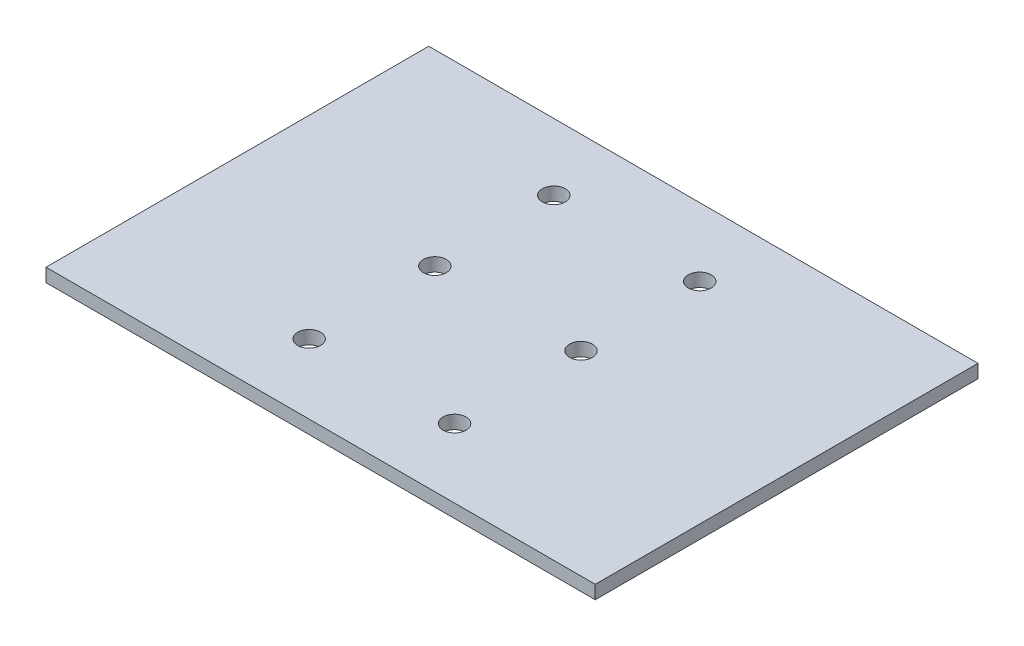
ISO-10303-21;
HEADER;
FILE_DESCRIPTION(('STEP AP214'),'2;1');
FILE_NAME('part.step','',(''),(''),'','','');
FILE_SCHEMA(('AUTOMOTIVE_DESIGN { 1 0 10303 214 1 1 1 1 }'));
ENDSEC;
DATA;
#1=APPLICATION_CONTEXT('core data for automotive mechanical design processes');
#2=APPLICATION_PROTOCOL_DEFINITION('international standard','automotive_design',2000,#1);
#3=PRODUCT_CONTEXT('',#1,'mechanical');
#4=PRODUCT('Part','Part','',(#3));
#5=PRODUCT_RELATED_PRODUCT_CATEGORY('part','',(#4));
#6=PRODUCT_DEFINITION_FORMATION('','',#4);
#7=PRODUCT_DEFINITION_CONTEXT('part definition',#1,'design');
#8=PRODUCT_DEFINITION('design','',#6,#7);
#9=PRODUCT_DEFINITION_SHAPE('','',#8);
#10=(LENGTH_UNIT() NAMED_UNIT(*) SI_UNIT(.MILLI.,.METRE.));
#11=(NAMED_UNIT(*) PLANE_ANGLE_UNIT() SI_UNIT($,.RADIAN.));
#12=(NAMED_UNIT(*) SI_UNIT($,.STERADIAN.) SOLID_ANGLE_UNIT());
#13=UNCERTAINTY_MEASURE_WITH_UNIT(LENGTH_MEASURE(1.E-05),#10,'distance_accuracy_value','');
#14=(GEOMETRIC_REPRESENTATION_CONTEXT(3) GLOBAL_UNCERTAINTY_ASSIGNED_CONTEXT((#13)) GLOBAL_UNIT_ASSIGNED_CONTEXT((#10,
#11,#12)) REPRESENTATION_CONTEXT('',''));
#15=CARTESIAN_POINT('',(0.,0.,0.));
#16=DIRECTION('',(0.,0.,1.));
#17=DIRECTION('',(1.,0.,0.));
#18=AXIS2_PLACEMENT_3D('',#15,#16,#17);
#19=CARTESIAN_POINT('',(0.,0.,0.));
#20=DIRECTION('',(0.,-1.,0.));
#21=DIRECTION('',(0.,0.,-1.));
#22=AXIS2_PLACEMENT_3D('',#19,#20,#21);
#23=PLANE('',#22);
#24=CARTESIAN_POINT('',(23.2212951849101,0.,-10.5729993652602));
#25=DIRECTION('',(0.,1.,0.));
#26=DIRECTION('',(0.,0.,1.));
#27=AXIS2_PLACEMENT_3D('',#24,#25,#26);
#28=CIRCLE('',#27,2.99999999999996);
#29=CARTESIAN_POINT('',(23.2212951849101,0.,-7.57299936526024));
#30=VERTEX_POINT('',#29);
#31=EDGE_CURVE('E142',#30,#30,#28,.T.);
#32=ORIENTED_EDGE('',*,*,#31,.T.);
#33=EDGE_LOOP('',(#32));
#34=FACE_BOUND('',#33,.T.);
#35=CARTESIAN_POINT('',(23.7222637231719,0.,53.8593610896501));
#36=DIRECTION('',(0.,1.,0.));
#37=DIRECTION('',(0.,0.,1.));
#38=AXIS2_PLACEMENT_3D('',#35,#36,#37);
#39=CIRCLE('',#38,2.99999999999996);
#40=CARTESIAN_POINT('',(23.7222637231719,0.,56.8593610896501));
#41=VERTEX_POINT('',#40);
#42=EDGE_CURVE('E136',#41,#41,#39,.T.);
#43=ORIENTED_EDGE('',*,*,#42,.T.);
#44=EDGE_LOOP('',(#43));
#45=FACE_BOUND('',#44,.T.);
#46=CARTESIAN_POINT('',(23.6824415477906,0.,20.9740262170182));
#47=DIRECTION('',(0.,1.,0.));
#48=DIRECTION('',(0.,0.,1.));
#49=AXIS2_PLACEMENT_3D('',#46,#47,#48);
#50=CIRCLE('',#49,2.99999999999996);
#51=CARTESIAN_POINT('',(23.6824415477906,0.,23.9740262170182));
#52=VERTEX_POINT('',#51);
#53=EDGE_CURVE('E130',#52,#52,#50,.T.);
#54=ORIENTED_EDGE('',*,*,#53,.T.);
#55=EDGE_LOOP('',(#54));
#56=FACE_BOUND('',#55,.T.);
#57=CARTESIAN_POINT('',(61.9369147996302,0.,21.0456926353382));
#58=DIRECTION('',(0.,1.,0.));
#59=DIRECTION('',(0.,0.,1.));
#60=AXIS2_PLACEMENT_3D('',#57,#58,#59);
#61=CIRCLE('',#60,2.99999999999996);
#62=CARTESIAN_POINT('',(61.9369147996302,0.,24.0456926353382));
#63=VERTEX_POINT('',#62);
#64=EDGE_CURVE('E124',#63,#63,#61,.T.);
#65=ORIENTED_EDGE('',*,*,#64,.T.);
#66=EDGE_LOOP('',(#65));
#67=FACE_BOUND('',#66,.T.);
#68=CARTESIAN_POINT('',(61.8992050962525,0.,54.0353472087433));
#69=DIRECTION('',(0.,1.,0.));
#70=DIRECTION('',(0.,0.,1.));
#71=AXIS2_PLACEMENT_3D('',#68,#69,#70);
#72=CIRCLE('',#71,2.99999999999996);
#73=CARTESIAN_POINT('',(61.8992050962525,0.,57.0353472087433));
#74=VERTEX_POINT('',#73);
#75=EDGE_CURVE('E108',#74,#74,#72,.T.);
#76=ORIENTED_EDGE('',*,*,#75,.T.);
#77=EDGE_LOOP('',(#76));
#78=FACE_BOUND('',#77,.T.);
#79=DIRECTION('',(0.,0.,1.));
#80=VECTOR('',#79,1.);
#81=CARTESIAN_POINT('',(-26.8538221253021,0.,72.027268619477));
#82=LINE('',#81,#80);
#83=CARTESIAN_POINT('',(-26.8538221253021,0.,-27.972731380523));
#84=VERTEX_POINT('',#83);
#85=CARTESIAN_POINT('',(-26.8538221253021,0.,72.027268619477));
#86=VERTEX_POINT('',#85);
#87=EDGE_CURVE('E105',#84,#86,#82,.T.);
#88=ORIENTED_EDGE('',*,*,#87,.F.);
#89=DIRECTION('',(-1.,0.,0.));
#90=VECTOR('',#89,1.);
#91=CARTESIAN_POINT('',(-26.8538221253021,0.,-27.972731380523));
#92=LINE('',#91,#90);
#93=CARTESIAN_POINT('',(116.646177874698,0.,-27.972731380523));
#94=VERTEX_POINT('',#93);
#95=EDGE_CURVE('E80',#94,#84,#92,.T.);
#96=ORIENTED_EDGE('',*,*,#95,.F.);
#97=DIRECTION('',(0.,0.,-1.));
#98=VECTOR('',#97,1.);
#99=CARTESIAN_POINT('',(116.646177874698,0.,-27.972731380523));
#100=LINE('',#99,#98);
#101=CARTESIAN_POINT('',(116.646177874698,0.,72.027268619477));
#102=VERTEX_POINT('',#101);
#103=EDGE_CURVE('E74',#102,#94,#100,.T.);
#104=ORIENTED_EDGE('',*,*,#103,.F.);
#105=DIRECTION('',(1.,0.,0.));
#106=VECTOR('',#105,1.);
#107=CARTESIAN_POINT('',(116.646177874698,0.,72.027268619477));
#108=LINE('',#107,#106);
#109=EDGE_CURVE('E97',#86,#102,#108,.T.);
#110=ORIENTED_EDGE('',*,*,#109,.F.);
#111=EDGE_LOOP('',(#88,#96,#104,#110));
#112=FACE_BOUND('',#111,.T.);
#113=CARTESIAN_POINT('',(61.7634432852718,0.,-10.1503564488982));
#114=DIRECTION('',(0.,1.,0.));
#115=DIRECTION('',(0.,0.,1.));
#116=AXIS2_PLACEMENT_3D('',#113,#114,#115);
#117=CIRCLE('',#116,2.99999999999996);
#118=CARTESIAN_POINT('',(61.7634432852718,0.,-7.15035644889822));
#119=VERTEX_POINT('',#118);
#120=EDGE_CURVE('E148',#119,#119,#117,.T.);
#121=ORIENTED_EDGE('',*,*,#120,.T.);
#122=EDGE_LOOP('',(#121));
#123=FACE_BOUND('',#122,.T.);
#124=ADVANCED_FACE('F40',(#34,#45,#56,#67,#78,#112,#123),#23,.T.);
#125=CARTESIAN_POINT('',(0.,3.5,0.));
#126=DIRECTION('',(0.,-1.,0.));
#127=DIRECTION('',(0.,0.,-1.));
#128=AXIS2_PLACEMENT_3D('',#125,#126,#127);
#129=PLANE('',#128);
#130=CARTESIAN_POINT('',(61.7634432852718,3.50000000000003,-10.1503564488982));
#131=DIRECTION('',(0.,1.,0.));
#132=DIRECTION('',(0.,0.,1.));
#133=AXIS2_PLACEMENT_3D('',#130,#131,#132);
#134=CIRCLE('',#133,2.99999999999999);
#135=CARTESIAN_POINT('',(61.7634432852718,3.50000000000003,-7.15035644889819));
#136=VERTEX_POINT('',#135);
#137=EDGE_CURVE('E151',#136,#136,#134,.T.);
#138=ORIENTED_EDGE('',*,*,#137,.F.);
#139=EDGE_LOOP('',(#138));
#140=FACE_BOUND('',#139,.T.);
#141=CARTESIAN_POINT('',(23.7222637231719,3.50000000000003,53.8593610896501));
#142=DIRECTION('',(0.,1.,0.));
#143=DIRECTION('',(0.,0.,1.));
#144=AXIS2_PLACEMENT_3D('',#141,#142,#143);
#145=CIRCLE('',#144,2.99999999999999);
#146=CARTESIAN_POINT('',(23.7222637231719,3.50000000000003,56.8593610896501));
#147=VERTEX_POINT('',#146);
#148=EDGE_CURVE('E139',#147,#147,#145,.T.);
#149=ORIENTED_EDGE('',*,*,#148,.F.);
#150=EDGE_LOOP('',(#149));
#151=FACE_BOUND('',#150,.T.);
#152=CARTESIAN_POINT('',(23.6824415477906,3.50000000000003,20.9740262170182));
#153=DIRECTION('',(0.,1.,0.));
#154=DIRECTION('',(0.,0.,1.));
#155=AXIS2_PLACEMENT_3D('',#152,#153,#154);
#156=CIRCLE('',#155,2.99999999999999);
#157=CARTESIAN_POINT('',(23.6824415477906,3.50000000000003,23.9740262170182));
#158=VERTEX_POINT('',#157);
#159=EDGE_CURVE('E133',#158,#158,#156,.T.);
#160=ORIENTED_EDGE('',*,*,#159,.F.);
#161=EDGE_LOOP('',(#160));
#162=FACE_BOUND('',#161,.T.);
#163=CARTESIAN_POINT('',(61.9369147996302,3.50000000000003,21.0456926353382));
#164=DIRECTION('',(0.,1.,0.));
#165=DIRECTION('',(0.,0.,1.));
#166=AXIS2_PLACEMENT_3D('',#163,#164,#165);
#167=CIRCLE('',#166,2.99999999999999);
#168=CARTESIAN_POINT('',(61.9369147996302,3.50000000000003,24.0456926353382));
#169=VERTEX_POINT('',#168);
#170=EDGE_CURVE('E127',#169,#169,#167,.T.);
#171=ORIENTED_EDGE('',*,*,#170,.F.);
#172=EDGE_LOOP('',(#171));
#173=FACE_BOUND('',#172,.T.);
#174=CARTESIAN_POINT('',(61.8992050962525,3.50000000000005,54.0353472087433));
#175=DIRECTION('',(0.,1.,0.));
#176=DIRECTION('',(0.,0.,1.));
#177=AXIS2_PLACEMENT_3D('',#174,#175,#176);
#178=CIRCLE('',#177,2.99999999999999);
#179=CARTESIAN_POINT('',(61.8992050962525,3.50000000000005,57.0353472087433));
#180=VERTEX_POINT('',#179);
#181=EDGE_CURVE('E121',#180,#180,#178,.T.);
#182=ORIENTED_EDGE('',*,*,#181,.F.);
#183=EDGE_LOOP('',(#182));
#184=FACE_BOUND('',#183,.T.);
#185=DIRECTION('',(0.,0.,1.));
#186=VECTOR('',#185,1.);
#187=CARTESIAN_POINT('',(-26.8538221253021,3.5,72.027268619477));
#188=LINE('',#187,#186);
#189=CARTESIAN_POINT('',(-26.8538221253021,3.5,-27.972731380523));
#190=VERTEX_POINT('',#189);
#191=CARTESIAN_POINT('',(-26.8538221253021,3.5,72.027268619477));
#192=VERTEX_POINT('',#191);
#193=EDGE_CURVE('E93',#190,#192,#188,.T.);
#194=ORIENTED_EDGE('',*,*,#193,.T.);
#195=DIRECTION('',(1.,0.,0.));
#196=VECTOR('',#195,1.);
#197=CARTESIAN_POINT('',(116.646177874698,3.5,72.027268619477));
#198=LINE('',#197,#196);
#199=CARTESIAN_POINT('',(116.646177874698,3.5,72.027268619477));
#200=VERTEX_POINT('',#199);
#201=EDGE_CURVE('E87',#192,#200,#198,.T.);
#202=ORIENTED_EDGE('',*,*,#201,.T.);
#203=DIRECTION('',(0.,0.,-1.));
#204=VECTOR('',#203,1.);
#205=CARTESIAN_POINT('',(116.646177874698,3.5,-27.972731380523));
#206=LINE('',#205,#204);
#207=CARTESIAN_POINT('',(116.646177874698,3.5,-27.972731380523));
#208=VERTEX_POINT('',#207);
#209=EDGE_CURVE('E91',#200,#208,#206,.T.);
#210=ORIENTED_EDGE('',*,*,#209,.T.);
#211=DIRECTION('',(-1.,0.,0.));
#212=VECTOR('',#211,1.);
#213=CARTESIAN_POINT('',(-26.8538221253021,3.5,-27.972731380523));
#214=LINE('',#213,#212);
#215=EDGE_CURVE('E57',#208,#190,#214,.T.);
#216=ORIENTED_EDGE('',*,*,#215,.T.);
#217=EDGE_LOOP('',(#194,#202,#210,#216));
#218=FACE_BOUND('',#217,.T.);
#219=CARTESIAN_POINT('',(23.2212951849101,3.50000000000003,-10.5729993652602));
#220=DIRECTION('',(0.,1.,0.));
#221=DIRECTION('',(0.,0.,1.));
#222=AXIS2_PLACEMENT_3D('',#219,#220,#221);
#223=CIRCLE('',#222,2.99999999999999);
#224=CARTESIAN_POINT('',(23.2212951849101,3.50000000000003,-7.57299936526021));
#225=VERTEX_POINT('',#224);
#226=EDGE_CURVE('E145',#225,#225,#223,.T.);
#227=ORIENTED_EDGE('',*,*,#226,.F.);
#228=EDGE_LOOP('',(#227));
#229=FACE_BOUND('',#228,.T.);
#230=ADVANCED_FACE('F88',(#140,#151,#162,#173,#184,#218,#229),#129,.F.);
#231=CARTESIAN_POINT('',(-26.8538221253021,3.5,72.027268619477));
#232=DIRECTION('',(1.,0.,0.));
#233=DIRECTION('',(0.,0.,-1.));
#234=AXIS2_PLACEMENT_3D('',#231,#232,#233);
#235=PLANE('',#234);
#236=ORIENTED_EDGE('',*,*,#87,.T.);
#237=DIRECTION('',(0.,-1.,0.));
#238=VECTOR('',#237,1.);
#239=CARTESIAN_POINT('',(-26.8538221253021,3.5,72.027268619477));
#240=LINE('',#239,#238);
#241=EDGE_CURVE('E11',#192,#86,#240,.T.);
#242=ORIENTED_EDGE('',*,*,#241,.F.);
#243=ORIENTED_EDGE('',*,*,#193,.F.);
#244=DIRECTION('',(0.,-1.,0.));
#245=VECTOR('',#244,1.);
#246=CARTESIAN_POINT('',(-26.8538221253021,3.5,-27.972731380523));
#247=LINE('',#246,#245);
#248=EDGE_CURVE('E101',#190,#84,#247,.T.);
#249=ORIENTED_EDGE('',*,*,#248,.T.);
#250=EDGE_LOOP('',(#236,#242,#243,#249));
#251=FACE_BOUND('',#250,.T.);
#252=ADVANCED_FACE('F42',(#251),#235,.F.);
#253=CARTESIAN_POINT('',(116.646177874698,3.5,72.027268619477));
#254=DIRECTION('',(0.,0.,-1.));
#255=DIRECTION('',(-1.,0.,0.));
#256=AXIS2_PLACEMENT_3D('',#253,#254,#255);
#257=PLANE('',#256);
#258=ORIENTED_EDGE('',*,*,#109,.T.);
#259=DIRECTION('',(0.,-1.,0.));
#260=VECTOR('',#259,1.);
#261=CARTESIAN_POINT('',(116.646177874698,3.5,72.027268619477));
#262=LINE('',#261,#260);
#263=EDGE_CURVE('E49',#200,#102,#262,.T.);
#264=ORIENTED_EDGE('',*,*,#263,.F.);
#265=ORIENTED_EDGE('',*,*,#201,.F.);
#266=ORIENTED_EDGE('',*,*,#241,.T.);
#267=EDGE_LOOP('',(#258,#264,#265,#266));
#268=FACE_BOUND('',#267,.T.);
#269=ADVANCED_FACE('F96',(#268),#257,.F.);
#270=CARTESIAN_POINT('',(116.646177874698,3.5,-27.972731380523));
#271=DIRECTION('',(-1.,0.,0.));
#272=DIRECTION('',(0.,0.,1.));
#273=AXIS2_PLACEMENT_3D('',#270,#271,#272);
#274=PLANE('',#273);
#275=ORIENTED_EDGE('',*,*,#103,.T.);
#276=DIRECTION('',(0.,-1.,0.));
#277=VECTOR('',#276,1.);
#278=CARTESIAN_POINT('',(116.646177874698,3.5,-27.972731380523));
#279=LINE('',#278,#277);
#280=EDGE_CURVE('E98',#208,#94,#279,.T.);
#281=ORIENTED_EDGE('',*,*,#280,.F.);
#282=ORIENTED_EDGE('',*,*,#209,.F.);
#283=ORIENTED_EDGE('',*,*,#263,.T.);
#284=EDGE_LOOP('',(#275,#281,#282,#283));
#285=FACE_BOUND('',#284,.T.);
#286=ADVANCED_FACE('F99',(#285),#274,.F.);
#287=CARTESIAN_POINT('',(-26.8538221253021,3.5,-27.972731380523));
#288=DIRECTION('',(0.,0.,1.));
#289=DIRECTION('',(1.,0.,0.));
#290=AXIS2_PLACEMENT_3D('',#287,#288,#289);
#291=PLANE('',#290);
#292=ORIENTED_EDGE('',*,*,#95,.T.);
#293=ORIENTED_EDGE('',*,*,#248,.F.);
#294=ORIENTED_EDGE('',*,*,#215,.F.);
#295=ORIENTED_EDGE('',*,*,#280,.T.);
#296=EDGE_LOOP('',(#292,#293,#294,#295));
#297=FACE_BOUND('',#296,.T.);
#298=ADVANCED_FACE('F113',(#297),#291,.F.);
#299=CARTESIAN_POINT('',(61.8992050962525,3.50000000000005,54.0353472087433));
#300=DIRECTION('',(0.,1.,0.));
#301=DIRECTION('',(0.,0.,1.));
#302=AXIS2_PLACEMENT_3D('',#299,#300,#301);
#303=CYLINDRICAL_SURFACE('',#302,2.99999999999998);
#304=ORIENTED_EDGE('',*,*,#75,.F.);
#305=EDGE_LOOP('',(#304));
#306=FACE_BOUND('',#305,.T.);
#307=ORIENTED_EDGE('',*,*,#181,.T.);
#308=EDGE_LOOP('',(#307));
#309=FACE_BOUND('',#308,.T.);
#310=ADVANCED_FACE('F168',(#306,#309),#303,.F.);
#311=CARTESIAN_POINT('',(61.9369147996302,3.50000000000003,21.0456926353382));
#312=DIRECTION('',(0.,1.,0.));
#313=DIRECTION('',(0.,0.,1.));
#314=AXIS2_PLACEMENT_3D('',#311,#312,#313);
#315=CYLINDRICAL_SURFACE('',#314,2.99999999999998);
#316=ORIENTED_EDGE('',*,*,#64,.F.);
#317=EDGE_LOOP('',(#316));
#318=FACE_BOUND('',#317,.T.);
#319=ORIENTED_EDGE('',*,*,#170,.T.);
#320=EDGE_LOOP('',(#319));
#321=FACE_BOUND('',#320,.T.);
#322=ADVANCED_FACE('F170',(#318,#321),#315,.F.);
#323=CARTESIAN_POINT('',(23.6824415477906,3.50000000000003,20.9740262170182));
#324=DIRECTION('',(0.,1.,0.));
#325=DIRECTION('',(0.,0.,1.));
#326=AXIS2_PLACEMENT_3D('',#323,#324,#325);
#327=CYLINDRICAL_SURFACE('',#326,2.99999999999998);
#328=ORIENTED_EDGE('',*,*,#53,.F.);
#329=EDGE_LOOP('',(#328));
#330=FACE_BOUND('',#329,.T.);
#331=ORIENTED_EDGE('',*,*,#159,.T.);
#332=EDGE_LOOP('',(#331));
#333=FACE_BOUND('',#332,.T.);
#334=ADVANCED_FACE('F177',(#330,#333),#327,.F.);
#335=CARTESIAN_POINT('',(23.7222637231719,3.50000000000003,53.8593610896501));
#336=DIRECTION('',(0.,1.,0.));
#337=DIRECTION('',(0.,0.,1.));
#338=AXIS2_PLACEMENT_3D('',#335,#336,#337);
#339=CYLINDRICAL_SURFACE('',#338,2.99999999999998);
#340=ORIENTED_EDGE('',*,*,#42,.F.);
#341=EDGE_LOOP('',(#340));
#342=FACE_BOUND('',#341,.T.);
#343=ORIENTED_EDGE('',*,*,#148,.T.);
#344=EDGE_LOOP('',(#343));
#345=FACE_BOUND('',#344,.T.);
#346=ADVANCED_FACE('F238',(#342,#345),#339,.F.);
#347=CARTESIAN_POINT('',(23.2212951849101,3.50000000000003,-10.5729993652602));
#348=DIRECTION('',(0.,1.,0.));
#349=DIRECTION('',(0.,0.,1.));
#350=AXIS2_PLACEMENT_3D('',#347,#348,#349);
#351=CYLINDRICAL_SURFACE('',#350,2.99999999999998);
#352=ORIENTED_EDGE('',*,*,#31,.F.);
#353=EDGE_LOOP('',(#352));
#354=FACE_BOUND('',#353,.T.);
#355=ORIENTED_EDGE('',*,*,#226,.T.);
#356=EDGE_LOOP('',(#355));
#357=FACE_BOUND('',#356,.T.);
#358=ADVANCED_FACE('F248',(#354,#357),#351,.F.);
#359=CARTESIAN_POINT('',(61.7634432852718,3.50000000000003,-10.1503564488982));
#360=DIRECTION('',(0.,1.,0.));
#361=DIRECTION('',(0.,0.,1.));
#362=AXIS2_PLACEMENT_3D('',#359,#360,#361);
#363=CYLINDRICAL_SURFACE('',#362,2.99999999999998);
#364=ORIENTED_EDGE('',*,*,#120,.F.);
#365=EDGE_LOOP('',(#364));
#366=FACE_BOUND('',#365,.T.);
#367=ORIENTED_EDGE('',*,*,#137,.T.);
#368=EDGE_LOOP('',(#367));
#369=FACE_BOUND('',#368,.T.);
#370=ADVANCED_FACE('F155',(#366,#369),#363,.F.);
#371=CLOSED_SHELL('',(#124,#230,#252,#269,#286,#298,#310,#322,#334,#346,#358,#370));
#372=MANIFOLD_SOLID_BREP('B2',#371);
#373=ADVANCED_BREP_SHAPE_REPRESENTATION('',(#18,#372),#14);
#374=SHAPE_DEFINITION_REPRESENTATION(#9,#373);
ENDSEC;
END-ISO-10303-21;
